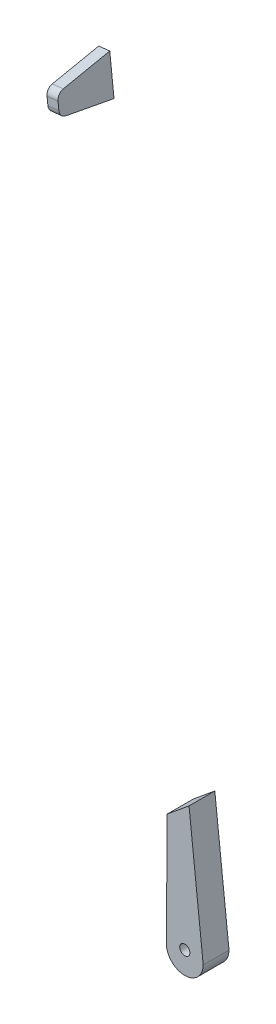
ISO-10303-21;
HEADER;
FILE_DESCRIPTION(('STEP AP214'),'2;1');
FILE_NAME('part.step','',(''),(''),'','','');
FILE_SCHEMA(('AUTOMOTIVE_DESIGN { 1 0 10303 214 1 1 1 1 }'));
ENDSEC;
DATA;
#1=APPLICATION_CONTEXT('core data for automotive mechanical design processes');
#2=APPLICATION_PROTOCOL_DEFINITION('international standard','automotive_design',2000,#1);
#3=PRODUCT_CONTEXT('',#1,'mechanical');
#4=PRODUCT('Part','Part','',(#3));
#5=PRODUCT_RELATED_PRODUCT_CATEGORY('part','',(#4));
#6=PRODUCT_DEFINITION_FORMATION('','',#4);
#7=PRODUCT_DEFINITION_CONTEXT('part definition',#1,'design');
#8=PRODUCT_DEFINITION('design','',#6,#7);
#9=PRODUCT_DEFINITION_SHAPE('','',#8);
#10=(LENGTH_UNIT() NAMED_UNIT(*) SI_UNIT(.MILLI.,.METRE.));
#11=(NAMED_UNIT(*) PLANE_ANGLE_UNIT() SI_UNIT($,.RADIAN.));
#12=(NAMED_UNIT(*) SI_UNIT($,.STERADIAN.) SOLID_ANGLE_UNIT());
#13=UNCERTAINTY_MEASURE_WITH_UNIT(LENGTH_MEASURE(1.E-05),#10,'distance_accuracy_value','');
#14=(GEOMETRIC_REPRESENTATION_CONTEXT(3) GLOBAL_UNCERTAINTY_ASSIGNED_CONTEXT((#13)) GLOBAL_UNIT_ASSIGNED_CONTEXT((#10,
#11,#12)) REPRESENTATION_CONTEXT('',''));
#15=CARTESIAN_POINT('',(0.,0.,0.));
#16=DIRECTION('',(0.,0.,1.));
#17=DIRECTION('',(1.,0.,0.));
#18=AXIS2_PLACEMENT_3D('',#15,#16,#17);
#19=CARTESIAN_POINT('',(1876.47880901373,203.488616473823,714.032961387439));
#20=DIRECTION('',(0.,0.,-1.));
#21=DIRECTION('',(0.,1.,0.));
#22=AXIS2_PLACEMENT_3D('',#19,#20,#21);
#23=PLANE('',#22);
#24=DIRECTION('',(-0.994171550267571,-0.107809687127713,0.));
#25=VECTOR('',#24,1.);
#26=CARTESIAN_POINT('',(1869.17763931555,270.816658980806,714.032961387437));
#27=LINE('',#26,#25);
#28=CARTESIAN_POINT('',(1869.17763931555,270.816658980806,714.032961387437));
#29=VERTEX_POINT('',#28);
#30=CARTESIAN_POINT('',(1865.38984570903,270.40590407285,714.032961387437));
#31=VERTEX_POINT('',#30);
#32=EDGE_CURVE('E120',#29,#31,#27,.T.);
#33=ORIENTED_EDGE('',*,*,#32,.T.);
#34=DIRECTION('',(0.107809687127714,-0.994171550267571,0.));
#35=VECTOR('',#34,1.);
#36=CARTESIAN_POINT('',(1872.69101540721,203.077861565867,714.032961387439));
#37=LINE('',#36,#35);
#38=CARTESIAN_POINT('',(1865.68198073394,267.711968691557,714.032961387437));
#39=VERTEX_POINT('',#38);
#40=EDGE_CURVE('E114',#31,#39,#37,.T.);
#41=ORIENTED_EDGE('',*,*,#40,.T.);
#42=DIRECTION('',(-0.994171550267571,-0.107809687127713,0.));
#43=VECTOR('',#42,1.);
#44=CARTESIAN_POINT('',(1869.46977434046,268.122723599514,714.032961387437));
#45=LINE('',#44,#43);
#46=CARTESIAN_POINT('',(1869.46977434046,268.122723599514,714.032961387437));
#47=VERTEX_POINT('',#46);
#48=EDGE_CURVE('E12',#47,#39,#45,.T.);
#49=ORIENTED_EDGE('',*,*,#48,.F.);
#50=DIRECTION('',(0.107809687127714,-0.994171550267571,0.));
#51=VECTOR('',#50,1.);
#52=CARTESIAN_POINT('',(1876.47880901373,203.488616473823,714.032961387439));
#53=LINE('',#52,#51);
#54=EDGE_CURVE('E131',#29,#47,#53,.T.);
#55=ORIENTED_EDGE('',*,*,#54,.F.);
#56=EDGE_LOOP('',(#33,#41,#49,#55));
#57=FACE_BOUND('',#56,.T.);
#58=ADVANCED_FACE('F49',(#57),#23,.F.);
#59=CARTESIAN_POINT('',(1869.46977434046,268.122723599514,711.492961387437));
#60=DIRECTION('',(-0.994171550267571,-0.107809687127713,0.));
#61=DIRECTION('',(0.107809687127713,-0.994171550267571,0.));
#62=AXIS2_PLACEMENT_3D('',#59,#60,#61);
#63=CYLINDRICAL_SURFACE('',#62,2.53999999999999);
#64=ORIENTED_EDGE('',*,*,#48,.T.);
#65=CARTESIAN_POINT('',(1865.68198073394,267.711968691557,711.492961387437));
#66=DIRECTION('',(0.994171550267571,0.107809687127714,0.));
#67=DIRECTION('',(-0.107809687127714,0.994171550267571,0.));
#68=AXIS2_PLACEMENT_3D('',#65,#66,#67);
#69=CIRCLE('',#68,2.53999999999999);
#70=CARTESIAN_POINT('',(1865.95171853231,265.224570273869,711.930786274593));
#71=VERTEX_POINT('',#70);
#72=EDGE_CURVE('E104',#39,#71,#69,.T.);
#73=ORIENTED_EDGE('',*,*,#72,.T.);
#74=DIRECTION('',(-0.994171550267571,-0.107809687127713,0.));
#75=VECTOR('',#74,1.);
#76=CARTESIAN_POINT('',(1869.73951213883,265.635325181826,711.930786274593));
#77=LINE('',#76,#75);
#78=CARTESIAN_POINT('',(1869.73951213883,265.635325181826,711.930786274593));
#79=VERTEX_POINT('',#78);
#80=EDGE_CURVE('E56',#79,#71,#77,.T.);
#81=ORIENTED_EDGE('',*,*,#80,.F.);
#82=CARTESIAN_POINT('',(1869.46977434046,268.122723599514,711.492961387437));
#83=DIRECTION('',(0.994171550267571,0.107809687127714,0.));
#84=DIRECTION('',(-0.107809687127714,0.994171550267571,0.));
#85=AXIS2_PLACEMENT_3D('',#82,#83,#84);
#86=CIRCLE('',#85,2.53999999999999);
#87=EDGE_CURVE('E105',#47,#79,#86,.T.);
#88=ORIENTED_EDGE('',*,*,#87,.F.);
#89=EDGE_LOOP('',(#64,#73,#81,#88));
#90=FACE_BOUND('',#89,.T.);
#91=ADVANCED_FACE('F102',(#90),#63,.T.);
#92=CARTESIAN_POINT('',(1882.97179652195,143.613259918246,10.5390921860169));
#93=DIRECTION('',(-0.106195983610885,0.979290715625164,-0.17237200281737));
#94=DIRECTION('',(0.,0.173352272081134,0.984859883315545));
#95=AXIS2_PLACEMENT_3D('',#92,#93,#94);
#96=PLANE('',#95);
#97=ORIENTED_EDGE('',*,*,#80,.T.);
#98=DIRECTION('',(0.0185833716933181,-0.17136734126367,-0.985031924683017));
#99=VECTOR('',#98,1.);
#100=CARTESIAN_POINT('',(1879.18400291543,143.202505010289,10.5390921860169));
#101=LINE('',#100,#99);
#102=CARTESIAN_POINT('',(1866.25973545139,262.384179339545,695.604012875079));
#103=VERTEX_POINT('',#102);
#104=EDGE_CURVE('E118',#71,#103,#101,.T.);
#105=ORIENTED_EDGE('',*,*,#104,.T.);
#106=DIRECTION('',(-0.994171550267571,-0.107809687127713,0.));
#107=VECTOR('',#106,1.);
#108=CARTESIAN_POINT('',(1870.04752905791,262.794934247502,695.604012875079));
#109=LINE('',#108,#107);
#110=CARTESIAN_POINT('',(1870.04752905791,262.794934247502,695.604012875079));
#111=VERTEX_POINT('',#110);
#112=EDGE_CURVE('E146',#111,#103,#109,.T.);
#113=ORIENTED_EDGE('',*,*,#112,.F.);
#114=DIRECTION('',(0.0185833716933181,-0.17136734126367,-0.985031924683017));
#115=VECTOR('',#114,1.);
#116=CARTESIAN_POINT('',(1882.97179652195,143.613259918246,10.5390921860169));
#117=LINE('',#116,#115);
#118=EDGE_CURVE('E134',#79,#111,#117,.T.);
#119=ORIENTED_EDGE('',*,*,#118,.F.);
#120=EDGE_LOOP('',(#97,#105,#113,#119));
#121=FACE_BOUND('',#120,.T.);
#122=ADVANCED_FACE('F149',(#121),#96,.F.);
#123=CARTESIAN_POINT('',(1876.50451749429,203.251544642391,695.58348038662));
#124=DIRECTION('',(-3.69595882754385E-05,0.000340824392983499,-0.999999941236359));
#125=DIRECTION('',(0.,0.999999941919365,0.000340824393216284));
#126=AXIS2_PLACEMENT_3D('',#123,#124,#125);
#127=PLANE('',#126);
#128=ORIENTED_EDGE('',*,*,#112,.T.);
#129=DIRECTION('',(0.107809680792424,-0.994171491846431,-0.000342822516789753));
#130=VECTOR('',#129,1.);
#131=CARTESIAN_POINT('',(1872.71672388777,202.840789734434,695.58348038662));
#132=LINE('',#131,#130);
#133=CARTESIAN_POINT('',(1864.79806039792,275.863077132648,695.608660835418));
#134=VERTEX_POINT('',#133);
#135=EDGE_CURVE('E124',#134,#103,#132,.T.);
#136=ORIENTED_EDGE('',*,*,#135,.F.);
#137=DIRECTION('',(-0.994171550267571,-0.107809687127713,0.));
#138=VECTOR('',#137,1.);
#139=CARTESIAN_POINT('',(1868.58585400444,276.273832040605,695.608660835418));
#140=LINE('',#139,#138);
#141=CARTESIAN_POINT('',(1868.58585400444,276.273832040605,695.608660835418));
#142=VERTEX_POINT('',#141);
#143=EDGE_CURVE('E144',#142,#134,#140,.T.);
#144=ORIENTED_EDGE('',*,*,#143,.F.);
#145=DIRECTION('',(0.107809680792424,-0.994171491846431,-0.000342822516789753));
#146=VECTOR('',#145,1.);
#147=CARTESIAN_POINT('',(1876.50451749429,203.251544642391,695.58348038662));
#148=LINE('',#147,#146);
#149=EDGE_CURVE('E136',#142,#111,#148,.T.);
#150=ORIENTED_EDGE('',*,*,#149,.T.);
#151=EDGE_LOOP('',(#128,#136,#144,#150));
#152=FACE_BOUND('',#151,.T.);
#153=ADVANCED_FACE('F153',(#152),#127,.T.);
#154=CARTESIAN_POINT('',(1855.56190329831,396.374739566505,35.5069832055344));
#155=DIRECTION('',(0.106048397446996,-0.977929743626624,-0.18001987092899));
#156=DIRECTION('',(0.,0.181040765350766,-0.983475592620991));
#157=AXIS2_PLACEMENT_3D('',#154,#155,#156);
#158=PLANE('',#157);
#159=ORIENTED_EDGE('',*,*,#143,.T.);
#160=DIRECTION('',(0.0194078859616258,-0.178970634160442,0.983662973823204));
#161=VECTOR('',#160,1.);
#162=CARTESIAN_POINT('',(1851.77410969179,395.963984658548,35.5069832055344));
#163=LINE('',#162,#161);
#164=CARTESIAN_POINT('',(1865.12048277952,272.889845621661,711.950211859596));
#165=VERTEX_POINT('',#164);
#166=EDGE_CURVE('E126',#134,#165,#163,.T.);
#167=ORIENTED_EDGE('',*,*,#166,.T.);
#168=DIRECTION('',(-0.994171550267571,-0.107809687127713,0.));
#169=VECTOR('',#168,1.);
#170=CARTESIAN_POINT('',(1868.90827638604,273.300600529618,711.950211859596));
#171=LINE('',#170,#169);
#172=CARTESIAN_POINT('',(1868.90827638604,273.300600529618,711.950211859596));
#173=VERTEX_POINT('',#172);
#174=EDGE_CURVE('E142',#173,#165,#171,.T.);
#175=ORIENTED_EDGE('',*,*,#174,.F.);
#176=DIRECTION('',(0.0194078859616258,-0.178970634160442,0.983662973823204));
#177=VECTOR('',#176,1.);
#178=CARTESIAN_POINT('',(1855.56190329831,396.374739566505,35.5069832055344));
#179=LINE('',#178,#177);
#180=EDGE_CURVE('E68',#142,#173,#179,.T.);
#181=ORIENTED_EDGE('',*,*,#180,.F.);
#182=EDGE_LOOP('',(#159,#167,#175,#181));
#183=FACE_BOUND('',#182,.T.);
#184=ADVANCED_FACE('F157',(#183),#158,.F.);
#185=CARTESIAN_POINT('',(1869.17763931555,270.816658980806,711.492961387437));
#186=DIRECTION('',(-0.994171550267571,-0.107809687127713,0.));
#187=DIRECTION('',(0.107809687127713,-0.994171550267571,0.));
#188=AXIS2_PLACEMENT_3D('',#185,#186,#187);
#189=CYLINDRICAL_SURFACE('',#188,2.53999999999992);
#190=ORIENTED_EDGE('',*,*,#174,.T.);
#191=CARTESIAN_POINT('',(1865.38984570903,270.40590407285,711.492961387437));
#192=DIRECTION('',(0.994171550267571,0.107809687127714,0.));
#193=DIRECTION('',(-0.107809687127714,0.994171550267571,0.));
#194=AXIS2_PLACEMENT_3D('',#191,#192,#193);
#195=CIRCLE('',#194,2.53999999999992);
#196=EDGE_CURVE('E129',#165,#31,#195,.T.);
#197=ORIENTED_EDGE('',*,*,#196,.T.);
#198=ORIENTED_EDGE('',*,*,#32,.F.);
#199=CARTESIAN_POINT('',(1869.17763931555,270.816658980806,711.492961387437));
#200=DIRECTION('',(0.994171550267571,0.107809687127714,0.));
#201=DIRECTION('',(-0.107809687127714,0.994171550267571,0.));
#202=AXIS2_PLACEMENT_3D('',#199,#200,#201);
#203=CIRCLE('',#202,2.53999999999992);
#204=EDGE_CURVE('E63',#173,#29,#203,.T.);
#205=ORIENTED_EDGE('',*,*,#204,.F.);
#206=EDGE_LOOP('',(#190,#197,#198,#205));
#207=FACE_BOUND('',#206,.T.);
#208=ADVANCED_FACE('F159',(#207),#189,.T.);
#209=CARTESIAN_POINT('',(1876.47880901373,203.488616473794,0.));
#210=DIRECTION('',(0.994171550267571,0.107809687127714,0.));
#211=DIRECTION('',(-0.107809687127714,0.994171550267571,0.));
#212=AXIS2_PLACEMENT_3D('',#209,#210,#211);
#213=PLANE('',#212);
#214=ORIENTED_EDGE('',*,*,#54,.T.);
#215=ORIENTED_EDGE('',*,*,#87,.T.);
#216=ORIENTED_EDGE('',*,*,#118,.T.);
#217=ORIENTED_EDGE('',*,*,#149,.F.);
#218=ORIENTED_EDGE('',*,*,#180,.T.);
#219=ORIENTED_EDGE('',*,*,#204,.T.);
#220=EDGE_LOOP('',(#214,#215,#216,#217,#218,#219));
#221=FACE_BOUND('',#220,.T.);
#222=ADVANCED_FACE('F151',(#221),#213,.T.);
#223=CARTESIAN_POINT('',(1872.69101540721,203.077861565838,0.));
#224=DIRECTION('',(0.994171550267571,0.107809687127714,0.));
#225=DIRECTION('',(-0.107809687127714,0.994171550267571,0.));
#226=AXIS2_PLACEMENT_3D('',#223,#224,#225);
#227=PLANE('',#226);
#228=ORIENTED_EDGE('',*,*,#40,.F.);
#229=ORIENTED_EDGE('',*,*,#196,.F.);
#230=ORIENTED_EDGE('',*,*,#166,.F.);
#231=ORIENTED_EDGE('',*,*,#135,.T.);
#232=ORIENTED_EDGE('',*,*,#104,.F.);
#233=ORIENTED_EDGE('',*,*,#72,.F.);
#234=EDGE_LOOP('',(#228,#229,#230,#231,#232,#233));
#235=FACE_BOUND('',#234,.T.);
#236=ADVANCED_FACE('F112',(#235),#227,.F.);
#237=CLOSED_SHELL('',(#58,#91,#122,#153,#184,#208,#222,#236));
#238=MANIFOLD_SOLID_BREP('B2',#237);
#239=CARTESIAN_POINT('',(1894.52725864881,19.6848463733733,695.699186752532));
#240=DIRECTION('',(0.,0.,-1.));
#241=DIRECTION('',(-1.,0.,0.));
#242=AXIS2_PLACEMENT_3D('',#239,#240,#241);
#243=CYLINDRICAL_SURFACE('',#242,6.36191889815963);
#244=CARTESIAN_POINT('',(1894.52725864881,19.6848463733733,686.809186752532));
#245=DIRECTION('',(0.,0.,1.));
#246=DIRECTION('',(1.,0.,0.));
#247=AXIS2_PLACEMENT_3D('',#244,#245,#246);
#248=CIRCLE('',#247,6.36191889815963);
#249=CARTESIAN_POINT('',(1900.88885158875,19.620446580855,686.809186752532));
#250=VERTEX_POINT('',#249);
#251=CARTESIAN_POINT('',(1888.16566570887,19.7492461658898,686.809186752532));
#252=VERTEX_POINT('',#251);
#253=EDGE_CURVE('E314',#250,#252,#248,.F.);
#254=ORIENTED_EDGE('',*,*,#253,.F.);
#255=DIRECTION('',(0.,0.,-1.));
#256=VECTOR('',#255,1.);
#257=CARTESIAN_POINT('',(1900.88885158875,19.620446580855,695.699186752532));
#258=LINE('',#257,#256);
#259=CARTESIAN_POINT('',(1900.88885158875,19.620446580855,695.699186752532));
#260=VERTEX_POINT('',#259);
#261=EDGE_CURVE('E47',#260,#250,#258,.T.);
#262=ORIENTED_EDGE('',*,*,#261,.F.);
#263=CARTESIAN_POINT('',(1894.52725864881,19.6848463733733,695.699186752532));
#264=DIRECTION('',(0.,0.,1.));
#265=DIRECTION('',(1.,0.,0.));
#266=AXIS2_PLACEMENT_3D('',#263,#264,#265);
#267=CIRCLE('',#266,6.36191889815963);
#268=CARTESIAN_POINT('',(1888.16566570887,19.7492461658898,695.699186752532));
#269=VERTEX_POINT('',#268);
#270=EDGE_CURVE('E296',#260,#269,#267,.F.);
#271=ORIENTED_EDGE('',*,*,#270,.T.);
#272=DIRECTION('',(0.,0.,-1.));
#273=VECTOR('',#272,1.);
#274=CARTESIAN_POINT('',(1888.16566570887,19.7492461658898,695.699186752532));
#275=LINE('',#274,#273);
#276=EDGE_CURVE('E263',#269,#252,#275,.T.);
#277=ORIENTED_EDGE('',*,*,#276,.T.);
#278=EDGE_LOOP('',(#254,#262,#271,#277));
#279=FACE_BOUND('',#278,.T.);
#280=ADVANCED_FACE('F247',(#279),#243,.T.);
#281=CARTESIAN_POINT('',(1880.89790155467,203.967830533076,695.699186752532));
#282=DIRECTION('',(-0.99417155026757,-0.107809687127713,0.));
#283=DIRECTION('',(0.107809687127713,-0.994171550267571,0.));
#284=AXIS2_PLACEMENT_3D('',#281,#282,#283);
#285=PLANE('',#284);
#286=DIRECTION('',(-0.107809687127713,0.994171550267571,0.));
#287=VECTOR('',#286,1.);
#288=CARTESIAN_POINT('',(1880.89790155467,203.967830533076,686.809186752532));
#289=LINE('',#288,#287);
#290=CARTESIAN_POINT('',(1896.00106136568,64.6934090660737,686.809186752532));
#291=VERTEX_POINT('',#290);
#292=EDGE_CURVE('E302',#250,#291,#289,.T.);
#293=ORIENTED_EDGE('',*,*,#292,.T.);
#294=DIRECTION('',(0.,0.,-1.));
#295=VECTOR('',#294,1.);
#296=CARTESIAN_POINT('',(1896.00106136568,64.6934090660737,695.699186752532));
#297=LINE('',#296,#295);
#298=CARTESIAN_POINT('',(1896.00106136568,64.6934090660737,695.699186752532));
#299=VERTEX_POINT('',#298);
#300=EDGE_CURVE('E255',#299,#291,#297,.T.);
#301=ORIENTED_EDGE('',*,*,#300,.F.);
#302=DIRECTION('',(-0.107809687127713,0.994171550267571,0.));
#303=VECTOR('',#302,1.);
#304=CARTESIAN_POINT('',(1880.89790155467,203.967830533076,695.699186752532));
#305=LINE('',#304,#303);
#306=EDGE_CURVE('E289',#260,#299,#305,.T.);
#307=ORIENTED_EDGE('',*,*,#306,.F.);
#308=ORIENTED_EDGE('',*,*,#261,.T.);
#309=EDGE_LOOP('',(#293,#301,#307,#308));
#310=FACE_BOUND('',#309,.T.);
#311=ADVANCED_FACE('F300',(#310),#285,.F.);
#312=CARTESIAN_POINT('',(3690.56390330483,-2118.09712552838,695.699186752532));
#313=DIRECTION('',(0.,0.,-1.));
#314=DIRECTION('',(-1.,0.,0.));
#315=AXIS2_PLACEMENT_3D('',#312,#313,#314);
#316=CYLINDRICAL_SURFACE('',#315,2825.77959359606);
#317=CARTESIAN_POINT('',(3690.56390330483,-2118.09712552838,686.809186752532));
#318=DIRECTION('',(0.,0.,1.));
#319=DIRECTION('',(1.,0.,0.));
#320=AXIS2_PLACEMENT_3D('',#317,#318,#319);
#321=CIRCLE('',#320,2825.77959359606);
#322=CARTESIAN_POINT('',(1888.49175704974,58.4979886982992,686.809186752532));
#323=VERTEX_POINT('',#322);
#324=EDGE_CURVE('E317',#291,#323,#321,.T.);
#325=ORIENTED_EDGE('',*,*,#324,.T.);
#326=DIRECTION('',(0.,0.,-1.));
#327=VECTOR('',#326,1.);
#328=CARTESIAN_POINT('',(1888.49175704974,58.4979886982992,695.699186752532));
#329=LINE('',#328,#327);
#330=CARTESIAN_POINT('',(1888.49175704974,58.4979886982992,695.699186752532));
#331=VERTEX_POINT('',#330);
#332=EDGE_CURVE('E277',#331,#323,#329,.T.);
#333=ORIENTED_EDGE('',*,*,#332,.F.);
#334=CARTESIAN_POINT('',(3690.56390330483,-2118.09712552838,695.699186752532));
#335=DIRECTION('',(0.,0.,1.));
#336=DIRECTION('',(1.,0.,0.));
#337=AXIS2_PLACEMENT_3D('',#334,#335,#336);
#338=CIRCLE('',#337,2825.77959359606);
#339=EDGE_CURVE('E295',#299,#331,#338,.T.);
#340=ORIENTED_EDGE('',*,*,#339,.F.);
#341=ORIENTED_EDGE('',*,*,#300,.T.);
#342=EDGE_LOOP('',(#325,#333,#340,#341));
#343=FACE_BOUND('',#342,.T.);
#344=ADVANCED_FACE('F305',(#343),#316,.T.);
#345=CARTESIAN_POINT('',(1887.86576433955,-15.8873975837948,695.699186752532));
#346=DIRECTION('',(-0.999964591278708,0.00841523551698046,0.));
#347=DIRECTION('',(-0.00841523551698046,-0.999964591278708,0.));
#348=AXIS2_PLACEMENT_3D('',#345,#346,#347);
#349=PLANE('',#348);
#350=DIRECTION('',(0.00841523551698046,0.999964591278708,0.));
#351=VECTOR('',#350,1.);
#352=CARTESIAN_POINT('',(1887.86576433955,-15.8873975837948,686.809186752532));
#353=LINE('',#352,#351);
#354=EDGE_CURVE('E319',#252,#323,#353,.T.);
#355=ORIENTED_EDGE('',*,*,#354,.F.);
#356=ORIENTED_EDGE('',*,*,#276,.F.);
#357=DIRECTION('',(0.00841523551698046,0.999964591278708,0.));
#358=VECTOR('',#357,1.);
#359=CARTESIAN_POINT('',(1887.86576433955,-15.8873975837948,695.699186752532));
#360=LINE('',#359,#358);
#361=EDGE_CURVE('E306',#269,#331,#360,.T.);
#362=ORIENTED_EDGE('',*,*,#361,.T.);
#363=ORIENTED_EDGE('',*,*,#332,.T.);
#364=EDGE_LOOP('',(#355,#356,#362,#363));
#365=FACE_BOUND('',#364,.T.);
#366=ADVANCED_FACE('F328',(#365),#349,.T.);
#367=CARTESIAN_POINT('',(1894.53755836465,20.9548046072743,695.699186752532));
#368=DIRECTION('',(0.,0.,-1.));
#369=DIRECTION('',(-1.,0.,0.));
#370=AXIS2_PLACEMENT_3D('',#367,#368,#369);
#371=CYLINDRICAL_SURFACE('',#370,1.75259999993825);
#372=CARTESIAN_POINT('',(1894.53755836465,20.9548046072743,695.699186752532));
#373=DIRECTION('',(0.,0.,1.));
#374=DIRECTION('',(1.,0.,0.));
#375=AXIS2_PLACEMENT_3D('',#372,#373,#374);
#376=CIRCLE('',#375,1.75259999993825);
#377=CARTESIAN_POINT('',(1896.29015836459,20.9548046072743,695.699186752532));
#378=VERTEX_POINT('',#377);
#379=EDGE_CURVE('E308',#378,#378,#376,.T.);
#380=ORIENTED_EDGE('',*,*,#379,.T.);
#381=EDGE_LOOP('',(#380));
#382=FACE_BOUND('',#381,.T.);
#383=CARTESIAN_POINT('',(1894.53755836465,20.9548046072743,686.809186752532));
#384=DIRECTION('',(0.,0.,1.));
#385=DIRECTION('',(1.,0.,0.));
#386=AXIS2_PLACEMENT_3D('',#383,#384,#385);
#387=CIRCLE('',#386,1.75259999993825);
#388=CARTESIAN_POINT('',(1896.29015836459,20.9548046072743,686.809186752532));
#389=VERTEX_POINT('',#388);
#390=EDGE_CURVE('E322',#389,#389,#387,.T.);
#391=ORIENTED_EDGE('',*,*,#390,.F.);
#392=EDGE_LOOP('',(#391));
#393=FACE_BOUND('',#392,.T.);
#394=ADVANCED_FACE('F330',(#382,#393),#371,.F.);
#395=CARTESIAN_POINT('',(0.,0.,695.699186752532));
#396=DIRECTION('',(0.,0.,1.));
#397=DIRECTION('',(1.,0.,0.));
#398=AXIS2_PLACEMENT_3D('',#395,#396,#397);
#399=PLANE('',#398);
#400=ORIENTED_EDGE('',*,*,#270,.F.);
#401=ORIENTED_EDGE('',*,*,#306,.T.);
#402=ORIENTED_EDGE('',*,*,#339,.T.);
#403=ORIENTED_EDGE('',*,*,#361,.F.);
#404=EDGE_LOOP('',(#400,#401,#402,#403));
#405=FACE_BOUND('',#404,.T.);
#406=ORIENTED_EDGE('',*,*,#379,.F.);
#407=EDGE_LOOP('',(#406));
#408=FACE_BOUND('',#407,.T.);
#409=ADVANCED_FACE('F291',(#405,#408),#399,.T.);
#410=CARTESIAN_POINT('',(0.,0.,686.809186752532));
#411=DIRECTION('',(0.,0.,1.));
#412=DIRECTION('',(1.,0.,0.));
#413=AXIS2_PLACEMENT_3D('',#410,#411,#412);
#414=PLANE('',#413);
#415=ORIENTED_EDGE('',*,*,#253,.T.);
#416=ORIENTED_EDGE('',*,*,#354,.T.);
#417=ORIENTED_EDGE('',*,*,#324,.F.);
#418=ORIENTED_EDGE('',*,*,#292,.F.);
#419=EDGE_LOOP('',(#415,#416,#417,#418));
#420=FACE_BOUND('',#419,.T.);
#421=ORIENTED_EDGE('',*,*,#390,.T.);
#422=EDGE_LOOP('',(#421));
#423=FACE_BOUND('',#422,.T.);
#424=ADVANCED_FACE('F371',(#420,#423),#414,.F.);
#425=CLOSED_SHELL('',(#280,#311,#344,#366,#394,#409,#424));
#426=MANIFOLD_SOLID_BREP('B6',#425);
#427=ADVANCED_BREP_SHAPE_REPRESENTATION('',(#18,#238,#426),#14);
#428=SHAPE_DEFINITION_REPRESENTATION(#9,#427);
ENDSEC;
END-ISO-10303-21;
